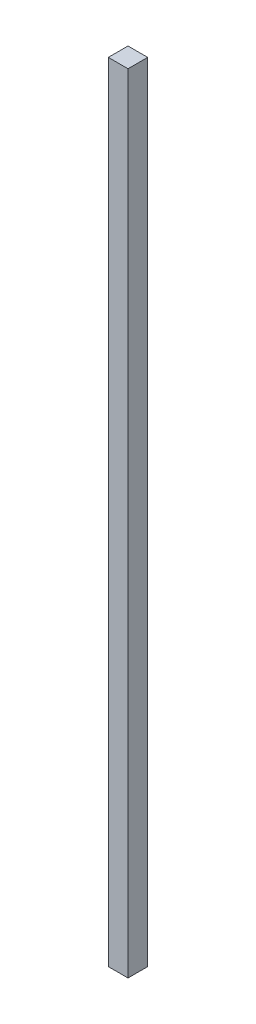
ISO-10303-21;
HEADER;
FILE_DESCRIPTION(('STEP AP214'),'2;1');
FILE_NAME('part.step','',(''),(''),'','','');
FILE_SCHEMA(('AUTOMOTIVE_DESIGN { 1 0 10303 214 1 1 1 1 }'));
ENDSEC;
DATA;
#1=APPLICATION_CONTEXT('core data for automotive mechanical design processes');
#2=APPLICATION_PROTOCOL_DEFINITION('international standard','automotive_design',2000,#1);
#3=PRODUCT_CONTEXT('',#1,'mechanical');
#4=PRODUCT('Part','Part','',(#3));
#5=PRODUCT_RELATED_PRODUCT_CATEGORY('part','',(#4));
#6=PRODUCT_DEFINITION_FORMATION('','',#4);
#7=PRODUCT_DEFINITION_CONTEXT('part definition',#1,'design');
#8=PRODUCT_DEFINITION('design','',#6,#7);
#9=PRODUCT_DEFINITION_SHAPE('','',#8);
#10=(LENGTH_UNIT() NAMED_UNIT(*) SI_UNIT(.MILLI.,.METRE.));
#11=(NAMED_UNIT(*) PLANE_ANGLE_UNIT() SI_UNIT($,.RADIAN.));
#12=(NAMED_UNIT(*) SI_UNIT($,.STERADIAN.) SOLID_ANGLE_UNIT());
#13=UNCERTAINTY_MEASURE_WITH_UNIT(LENGTH_MEASURE(1.E-05),#10,'distance_accuracy_value','');
#14=(GEOMETRIC_REPRESENTATION_CONTEXT(3) GLOBAL_UNCERTAINTY_ASSIGNED_CONTEXT((#13)) GLOBAL_UNIT_ASSIGNED_CONTEXT((#10,
#11,#12)) REPRESENTATION_CONTEXT('',''));
#15=CARTESIAN_POINT('',(0.,0.,0.));
#16=DIRECTION('',(0.,0.,1.));
#17=DIRECTION('',(1.,0.,0.));
#18=AXIS2_PLACEMENT_3D('',#15,#16,#17);
#19=CARTESIAN_POINT('',(0.,1000.,0.));
#20=DIRECTION('',(-1.,0.,0.));
#21=DIRECTION('',(0.,0.,1.));
#22=AXIS2_PLACEMENT_3D('',#19,#20,#21);
#23=PLANE('',#22);
#24=DIRECTION('',(0.,0.,-1.));
#25=VECTOR('',#24,1.);
#26=CARTESIAN_POINT('',(0.,0.,0.));
#27=LINE('',#26,#25);
#28=CARTESIAN_POINT('',(0.,0.,25.));
#29=VERTEX_POINT('',#28);
#30=CARTESIAN_POINT('',(0.,0.,0.));
#31=VERTEX_POINT('',#30);
#32=EDGE_CURVE('E96',#29,#31,#27,.T.);
#33=ORIENTED_EDGE('',*,*,#32,.T.);
#34=DIRECTION('',(0.,-1.,0.));
#35=VECTOR('',#34,1.);
#36=CARTESIAN_POINT('',(0.,1000.,0.));
#37=LINE('',#36,#35);
#38=CARTESIAN_POINT('',(0.,1000.,0.));
#39=VERTEX_POINT('',#38);
#40=EDGE_CURVE('E11',#39,#31,#37,.T.);
#41=ORIENTED_EDGE('',*,*,#40,.F.);
#42=DIRECTION('',(0.,0.,-1.));
#43=VECTOR('',#42,1.);
#44=CARTESIAN_POINT('',(0.,1000.,0.));
#45=LINE('',#44,#43);
#46=CARTESIAN_POINT('',(0.,1000.,25.));
#47=VERTEX_POINT('',#46);
#48=EDGE_CURVE('E84',#47,#39,#45,.T.);
#49=ORIENTED_EDGE('',*,*,#48,.F.);
#50=DIRECTION('',(0.,-1.,0.));
#51=VECTOR('',#50,1.);
#52=CARTESIAN_POINT('',(0.,1000.,25.));
#53=LINE('',#52,#51);
#54=EDGE_CURVE('E92',#47,#29,#53,.T.);
#55=ORIENTED_EDGE('',*,*,#54,.T.);
#56=EDGE_LOOP('',(#33,#41,#49,#55));
#57=FACE_BOUND('',#56,.T.);
#58=ADVANCED_FACE('F33',(#57),#23,.F.);
#59=CARTESIAN_POINT('',(0.,1000.,0.));
#60=DIRECTION('',(0.,0.,1.));
#61=DIRECTION('',(1.,0.,0.));
#62=AXIS2_PLACEMENT_3D('',#59,#60,#61);
#63=PLANE('',#62);
#64=DIRECTION('',(-1.,0.,0.));
#65=VECTOR('',#64,1.);
#66=CARTESIAN_POINT('',(0.,0.,0.));
#67=LINE('',#66,#65);
#68=CARTESIAN_POINT('',(-25.,0.,0.));
#69=VERTEX_POINT('',#68);
#70=EDGE_CURVE('E88',#31,#69,#67,.T.);
#71=ORIENTED_EDGE('',*,*,#70,.T.);
#72=DIRECTION('',(0.,-1.,0.));
#73=VECTOR('',#72,1.);
#74=CARTESIAN_POINT('',(-25.,1000.,0.));
#75=LINE('',#74,#73);
#76=CARTESIAN_POINT('',(-25.,1000.,0.));
#77=VERTEX_POINT('',#76);
#78=EDGE_CURVE('E41',#77,#69,#75,.T.);
#79=ORIENTED_EDGE('',*,*,#78,.F.);
#80=DIRECTION('',(-1.,0.,0.));
#81=VECTOR('',#80,1.);
#82=CARTESIAN_POINT('',(0.,1000.,0.));
#83=LINE('',#82,#81);
#84=EDGE_CURVE('E79',#39,#77,#83,.T.);
#85=ORIENTED_EDGE('',*,*,#84,.F.);
#86=ORIENTED_EDGE('',*,*,#40,.T.);
#87=EDGE_LOOP('',(#71,#79,#85,#86));
#88=FACE_BOUND('',#87,.T.);
#89=ADVANCED_FACE('F87',(#88),#63,.F.);
#90=CARTESIAN_POINT('',(-25.,1000.,0.));
#91=DIRECTION('',(1.,0.,0.));
#92=DIRECTION('',(0.,0.,-1.));
#93=AXIS2_PLACEMENT_3D('',#90,#91,#92);
#94=PLANE('',#93);
#95=DIRECTION('',(0.,0.,1.));
#96=VECTOR('',#95,1.);
#97=CARTESIAN_POINT('',(-25.,0.,0.));
#98=LINE('',#97,#96);
#99=CARTESIAN_POINT('',(-25.,0.,25.));
#100=VERTEX_POINT('',#99);
#101=EDGE_CURVE('E66',#69,#100,#98,.T.);
#102=ORIENTED_EDGE('',*,*,#101,.T.);
#103=DIRECTION('',(0.,-1.,0.));
#104=VECTOR('',#103,1.);
#105=CARTESIAN_POINT('',(-25.,1000.,25.));
#106=LINE('',#105,#104);
#107=CARTESIAN_POINT('',(-25.,1000.,25.));
#108=VERTEX_POINT('',#107);
#109=EDGE_CURVE('E89',#108,#100,#106,.T.);
#110=ORIENTED_EDGE('',*,*,#109,.F.);
#111=DIRECTION('',(0.,0.,1.));
#112=VECTOR('',#111,1.);
#113=CARTESIAN_POINT('',(-25.,1000.,0.));
#114=LINE('',#113,#112);
#115=EDGE_CURVE('E82',#77,#108,#114,.T.);
#116=ORIENTED_EDGE('',*,*,#115,.F.);
#117=ORIENTED_EDGE('',*,*,#78,.T.);
#118=EDGE_LOOP('',(#102,#110,#116,#117));
#119=FACE_BOUND('',#118,.T.);
#120=ADVANCED_FACE('F90',(#119),#94,.F.);
#121=CARTESIAN_POINT('',(0.,1000.,25.));
#122=DIRECTION('',(0.,0.,-1.));
#123=DIRECTION('',(-1.,0.,0.));
#124=AXIS2_PLACEMENT_3D('',#121,#122,#123);
#125=PLANE('',#124);
#126=DIRECTION('',(1.,0.,0.));
#127=VECTOR('',#126,1.);
#128=CARTESIAN_POINT('',(0.,0.,25.));
#129=LINE('',#128,#127);
#130=EDGE_CURVE('E72',#100,#29,#129,.T.);
#131=ORIENTED_EDGE('',*,*,#130,.T.);
#132=ORIENTED_EDGE('',*,*,#54,.F.);
#133=DIRECTION('',(1.,0.,0.));
#134=VECTOR('',#133,1.);
#135=CARTESIAN_POINT('',(0.,1000.,25.));
#136=LINE('',#135,#134);
#137=EDGE_CURVE('E49',#108,#47,#136,.T.);
#138=ORIENTED_EDGE('',*,*,#137,.F.);
#139=ORIENTED_EDGE('',*,*,#109,.T.);
#140=EDGE_LOOP('',(#131,#132,#138,#139));
#141=FACE_BOUND('',#140,.T.);
#142=ADVANCED_FACE('F103',(#141),#125,.F.);
#143=CARTESIAN_POINT('',(0.,1000.,0.));
#144=DIRECTION('',(0.,-1.,0.));
#145=DIRECTION('',(0.,0.,-1.));
#146=AXIS2_PLACEMENT_3D('',#143,#144,#145);
#147=PLANE('',#146);
#148=ORIENTED_EDGE('',*,*,#48,.T.);
#149=ORIENTED_EDGE('',*,*,#84,.T.);
#150=ORIENTED_EDGE('',*,*,#115,.T.);
#151=ORIENTED_EDGE('',*,*,#137,.T.);
#152=EDGE_LOOP('',(#148,#149,#150,#151));
#153=FACE_BOUND('',#152,.T.);
#154=ADVANCED_FACE('F80',(#153),#147,.F.);
#155=CARTESIAN_POINT('',(0.,0.,0.));
#156=DIRECTION('',(0.,-1.,0.));
#157=DIRECTION('',(0.,0.,-1.));
#158=AXIS2_PLACEMENT_3D('',#155,#156,#157);
#159=PLANE('',#158);
#160=ORIENTED_EDGE('',*,*,#32,.F.);
#161=ORIENTED_EDGE('',*,*,#130,.F.);
#162=ORIENTED_EDGE('',*,*,#101,.F.);
#163=ORIENTED_EDGE('',*,*,#70,.F.);
#164=EDGE_LOOP('',(#160,#161,#162,#163));
#165=FACE_BOUND('',#164,.T.);
#166=ADVANCED_FACE('F106',(#165),#159,.T.);
#167=CLOSED_SHELL('',(#58,#89,#120,#142,#154,#166));
#168=MANIFOLD_SOLID_BREP('B2',#167);
#169=ADVANCED_BREP_SHAPE_REPRESENTATION('',(#18,#168),#14);
#170=SHAPE_DEFINITION_REPRESENTATION(#9,#169);
ENDSEC;
END-ISO-10303-21;
